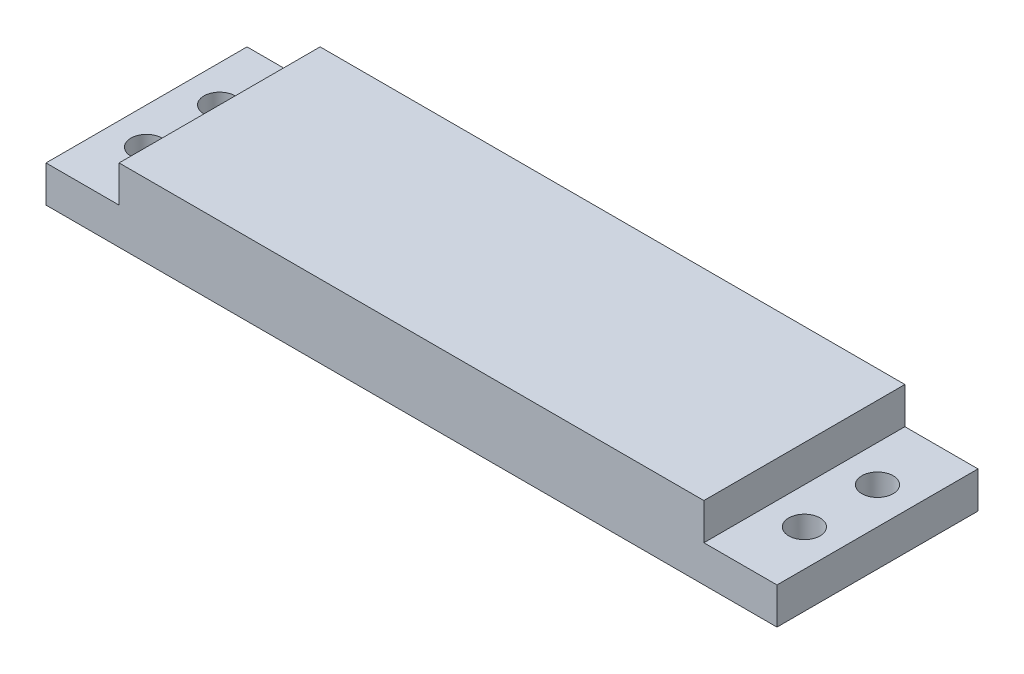
ISO-10303-21;
HEADER;
FILE_DESCRIPTION(('STEP AP214'),'2;1');
FILE_NAME('part.step','',(''),(''),'','','');
FILE_SCHEMA(('AUTOMOTIVE_DESIGN { 1 0 10303 214 1 1 1 1 }'));
ENDSEC;
DATA;
#1=APPLICATION_CONTEXT('core data for automotive mechanical design processes');
#2=APPLICATION_PROTOCOL_DEFINITION('international standard','automotive_design',2000,#1);
#3=PRODUCT_CONTEXT('',#1,'mechanical');
#4=PRODUCT('Part','Part','',(#3));
#5=PRODUCT_RELATED_PRODUCT_CATEGORY('part','',(#4));
#6=PRODUCT_DEFINITION_FORMATION('','',#4);
#7=PRODUCT_DEFINITION_CONTEXT('part definition',#1,'design');
#8=PRODUCT_DEFINITION('design','',#6,#7);
#9=PRODUCT_DEFINITION_SHAPE('','',#8);
#10=(LENGTH_UNIT() NAMED_UNIT(*) SI_UNIT(.MILLI.,.METRE.));
#11=(NAMED_UNIT(*) PLANE_ANGLE_UNIT() SI_UNIT($,.RADIAN.));
#12=(NAMED_UNIT(*) SI_UNIT($,.STERADIAN.) SOLID_ANGLE_UNIT());
#13=UNCERTAINTY_MEASURE_WITH_UNIT(LENGTH_MEASURE(1.E-05),#10,'distance_accuracy_value','');
#14=(GEOMETRIC_REPRESENTATION_CONTEXT(3) GLOBAL_UNCERTAINTY_ASSIGNED_CONTEXT((#13)) GLOBAL_UNIT_ASSIGNED_CONTEXT((#10,
#11,#12)) REPRESENTATION_CONTEXT('',''));
#15=CARTESIAN_POINT('',(0.,0.,0.));
#16=DIRECTION('',(0.,0.,1.));
#17=DIRECTION('',(1.,0.,0.));
#18=AXIS2_PLACEMENT_3D('',#15,#16,#17);
#19=CARTESIAN_POINT('',(0.,6.35,0.));
#20=DIRECTION('',(-1.,0.,0.));
#21=DIRECTION('',(0.,0.,1.));
#22=AXIS2_PLACEMENT_3D('',#19,#20,#21);
#23=PLANE('',#22);
#24=DIRECTION('',(0.,-1.,0.));
#25=VECTOR('',#24,1.);
#26=CARTESIAN_POINT('',(0.,6.35,-17.4625));
#27=LINE('',#26,#25);
#28=CARTESIAN_POINT('',(0.,3.175,-17.4625));
#29=VERTEX_POINT('',#28);
#30=CARTESIAN_POINT('',(0.,0.,-17.4625));
#31=VERTEX_POINT('',#30);
#32=EDGE_CURVE('E11',#29,#31,#27,.T.);
#33=ORIENTED_EDGE('',*,*,#32,.F.);
#34=DIRECTION('',(0.,0.,1.));
#35=VECTOR('',#34,1.);
#36=CARTESIAN_POINT('',(0.,3.175,-17.4625));
#37=LINE('',#36,#35);
#38=CARTESIAN_POINT('',(0.,3.175,0.));
#39=VERTEX_POINT('',#38);
#40=EDGE_CURVE('E104',#29,#39,#37,.T.);
#41=ORIENTED_EDGE('',*,*,#40,.T.);
#42=DIRECTION('',(0.,-1.,0.));
#43=VECTOR('',#42,1.);
#44=CARTESIAN_POINT('',(0.,6.35,0.));
#45=LINE('',#44,#43);
#46=CARTESIAN_POINT('',(0.,0.,0.));
#47=VERTEX_POINT('',#46);
#48=EDGE_CURVE('E150',#39,#47,#45,.T.);
#49=ORIENTED_EDGE('',*,*,#48,.T.);
#50=DIRECTION('',(0.,0.,-1.));
#51=VECTOR('',#50,1.);
#52=CARTESIAN_POINT('',(0.,0.,0.));
#53=LINE('',#52,#51);
#54=EDGE_CURVE('E141',#47,#31,#53,.T.);
#55=ORIENTED_EDGE('',*,*,#54,.T.);
#56=EDGE_LOOP('',(#33,#41,#49,#55));
#57=FACE_BOUND('',#56,.T.);
#58=ADVANCED_FACE('F33',(#57),#23,.F.);
#59=CARTESIAN_POINT('',(0.,6.35,-17.4625));
#60=DIRECTION('',(0.,0.,1.));
#61=DIRECTION('',(1.,0.,0.));
#62=AXIS2_PLACEMENT_3D('',#59,#60,#61);
#63=PLANE('',#62);
#64=DIRECTION('',(0.,-1.,0.));
#65=VECTOR('',#64,1.);
#66=CARTESIAN_POINT('',(-6.35,6.35,-17.4625));
#67=LINE('',#66,#65);
#68=CARTESIAN_POINT('',(-6.35,6.35,-17.4625));
#69=VERTEX_POINT('',#68);
#70=CARTESIAN_POINT('',(-6.35,3.175,-17.4625));
#71=VERTEX_POINT('',#70);
#72=EDGE_CURVE('E49',#69,#71,#67,.T.);
#73=ORIENTED_EDGE('',*,*,#72,.T.);
#74=DIRECTION('',(1.,0.,0.));
#75=VECTOR('',#74,1.);
#76=CARTESIAN_POINT('',(0.,3.175,-17.4625));
#77=LINE('',#76,#75);
#78=EDGE_CURVE('E108',#71,#29,#77,.T.);
#79=ORIENTED_EDGE('',*,*,#78,.T.);
#80=ORIENTED_EDGE('',*,*,#32,.T.);
#81=DIRECTION('',(-1.,0.,0.));
#82=VECTOR('',#81,1.);
#83=CARTESIAN_POINT('',(0.,0.,-17.4625));
#84=LINE('',#83,#82);
#85=CARTESIAN_POINT('',(-63.5,0.,-17.4625));
#86=VERTEX_POINT('',#85);
#87=EDGE_CURVE('E153',#31,#86,#84,.T.);
#88=ORIENTED_EDGE('',*,*,#87,.T.);
#89=DIRECTION('',(0.,-1.,0.));
#90=VECTOR('',#89,1.);
#91=CARTESIAN_POINT('',(-63.5,6.35,-17.4625));
#92=LINE('',#91,#90);
#93=CARTESIAN_POINT('',(-63.5,3.175,-17.4625));
#94=VERTEX_POINT('',#93);
#95=EDGE_CURVE('E41',#94,#86,#92,.T.);
#96=ORIENTED_EDGE('',*,*,#95,.F.);
#97=DIRECTION('',(1.,0.,0.));
#98=VECTOR('',#97,1.);
#99=CARTESIAN_POINT('',(-63.5,3.175,-17.4625));
#100=LINE('',#99,#98);
#101=CARTESIAN_POINT('',(-57.15,3.175,-17.4625));
#102=VERTEX_POINT('',#101);
#103=EDGE_CURVE('E130',#94,#102,#100,.T.);
#104=ORIENTED_EDGE('',*,*,#103,.T.);
#105=DIRECTION('',(0.,1.,0.));
#106=VECTOR('',#105,1.);
#107=CARTESIAN_POINT('',(-57.15,6.35,-17.4625));
#108=LINE('',#107,#106);
#109=CARTESIAN_POINT('',(-57.15,6.35,-17.4625));
#110=VERTEX_POINT('',#109);
#111=EDGE_CURVE('E133',#102,#110,#108,.T.);
#112=ORIENTED_EDGE('',*,*,#111,.T.);
#113=DIRECTION('',(-1.,0.,0.));
#114=VECTOR('',#113,1.);
#115=CARTESIAN_POINT('',(0.,6.35,-17.4625));
#116=LINE('',#115,#114);
#117=EDGE_CURVE('E117',#69,#110,#116,.T.);
#118=ORIENTED_EDGE('',*,*,#117,.F.);
#119=EDGE_LOOP('',(#73,#79,#80,#88,#96,#104,#112,#118));
#120=FACE_BOUND('',#119,.T.);
#121=ADVANCED_FACE('F115',(#120),#63,.F.);
#122=CARTESIAN_POINT('',(-63.5,6.35,0.));
#123=DIRECTION('',(1.,0.,0.));
#124=DIRECTION('',(0.,0.,-1.));
#125=AXIS2_PLACEMENT_3D('',#122,#123,#124);
#126=PLANE('',#125);
#127=DIRECTION('',(0.,-1.,0.));
#128=VECTOR('',#127,1.);
#129=CARTESIAN_POINT('',(-63.5,6.35,0.));
#130=LINE('',#129,#128);
#131=CARTESIAN_POINT('',(-63.5,3.175,0.));
#132=VERTEX_POINT('',#131);
#133=CARTESIAN_POINT('',(-63.5,0.,0.));
#134=VERTEX_POINT('',#133);
#135=EDGE_CURVE('E162',#132,#134,#130,.T.);
#136=ORIENTED_EDGE('',*,*,#135,.F.);
#137=DIRECTION('',(0.,0.,1.));
#138=VECTOR('',#137,1.);
#139=CARTESIAN_POINT('',(-63.5,3.175,-17.4625));
#140=LINE('',#139,#138);
#141=EDGE_CURVE('E135',#94,#132,#140,.T.);
#142=ORIENTED_EDGE('',*,*,#141,.F.);
#143=ORIENTED_EDGE('',*,*,#95,.T.);
#144=DIRECTION('',(0.,0.,1.));
#145=VECTOR('',#144,1.);
#146=CARTESIAN_POINT('',(-63.5,0.,0.));
#147=LINE('',#146,#145);
#148=EDGE_CURVE('E156',#86,#134,#147,.T.);
#149=ORIENTED_EDGE('',*,*,#148,.T.);
#150=EDGE_LOOP('',(#136,#142,#143,#149));
#151=FACE_BOUND('',#150,.T.);
#152=ADVANCED_FACE('F213',(#151),#126,.F.);
#153=CARTESIAN_POINT('',(0.,6.35,0.));
#154=DIRECTION('',(0.,0.,-1.));
#155=DIRECTION('',(-1.,0.,0.));
#156=AXIS2_PLACEMENT_3D('',#153,#154,#155);
#157=PLANE('',#156);
#158=ORIENTED_EDGE('',*,*,#48,.F.);
#159=DIRECTION('',(1.,0.,0.));
#160=VECTOR('',#159,1.);
#161=CARTESIAN_POINT('',(0.,3.175,0.));
#162=LINE('',#161,#160);
#163=CARTESIAN_POINT('',(-6.35,3.175,0.));
#164=VERTEX_POINT('',#163);
#165=EDGE_CURVE('E118',#164,#39,#162,.T.);
#166=ORIENTED_EDGE('',*,*,#165,.F.);
#167=DIRECTION('',(0.,-1.,0.));
#168=VECTOR('',#167,1.);
#169=CARTESIAN_POINT('',(-6.35,6.35,0.));
#170=LINE('',#169,#168);
#171=CARTESIAN_POINT('',(-6.35,6.35,0.));
#172=VERTEX_POINT('',#171);
#173=EDGE_CURVE('E101',#172,#164,#170,.T.);
#174=ORIENTED_EDGE('',*,*,#173,.F.);
#175=DIRECTION('',(1.,0.,0.));
#176=VECTOR('',#175,1.);
#177=CARTESIAN_POINT('',(0.,6.35,0.));
#178=LINE('',#177,#176);
#179=CARTESIAN_POINT('',(-57.15,6.35,0.));
#180=VERTEX_POINT('',#179);
#181=EDGE_CURVE('E146',#180,#172,#178,.T.);
#182=ORIENTED_EDGE('',*,*,#181,.F.);
#183=DIRECTION('',(0.,1.,0.));
#184=VECTOR('',#183,1.);
#185=CARTESIAN_POINT('',(-57.15,6.35,0.));
#186=LINE('',#185,#184);
#187=CARTESIAN_POINT('',(-57.15,3.175,0.));
#188=VERTEX_POINT('',#187);
#189=EDGE_CURVE('E57',#188,#180,#186,.T.);
#190=ORIENTED_EDGE('',*,*,#189,.F.);
#191=DIRECTION('',(1.,0.,0.));
#192=VECTOR('',#191,1.);
#193=CARTESIAN_POINT('',(-63.5,3.175,0.));
#194=LINE('',#193,#192);
#195=EDGE_CURVE('E127',#132,#188,#194,.T.);
#196=ORIENTED_EDGE('',*,*,#195,.F.);
#197=ORIENTED_EDGE('',*,*,#135,.T.);
#198=DIRECTION('',(1.,0.,0.));
#199=VECTOR('',#198,1.);
#200=CARTESIAN_POINT('',(0.,0.,0.));
#201=LINE('',#200,#199);
#202=EDGE_CURVE('E147',#134,#47,#201,.T.);
#203=ORIENTED_EDGE('',*,*,#202,.T.);
#204=EDGE_LOOP('',(#158,#166,#174,#182,#190,#196,#197,#203));
#205=FACE_BOUND('',#204,.T.);
#206=ADVANCED_FACE('F231',(#205),#157,.F.);
#207=CARTESIAN_POINT('',(0.,6.35,0.));
#208=DIRECTION('',(0.,1.,0.));
#209=DIRECTION('',(0.,0.,1.));
#210=AXIS2_PLACEMENT_3D('',#207,#208,#209);
#211=PLANE('',#210);
#212=DIRECTION('',(0.,0.,1.));
#213=VECTOR('',#212,1.);
#214=CARTESIAN_POINT('',(-6.35,6.35,-17.4625));
#215=LINE('',#214,#213);
#216=EDGE_CURVE('E105',#69,#172,#215,.T.);
#217=ORIENTED_EDGE('',*,*,#216,.F.);
#218=ORIENTED_EDGE('',*,*,#117,.T.);
#219=DIRECTION('',(0.,0.,1.));
#220=VECTOR('',#219,1.);
#221=CARTESIAN_POINT('',(-57.15,6.35,-17.4625));
#222=LINE('',#221,#220);
#223=EDGE_CURVE('E139',#110,#180,#222,.T.);
#224=ORIENTED_EDGE('',*,*,#223,.T.);
#225=ORIENTED_EDGE('',*,*,#181,.T.);
#226=EDGE_LOOP('',(#217,#218,#224,#225));
#227=FACE_BOUND('',#226,.T.);
#228=ADVANCED_FACE('F229',(#227),#211,.T.);
#229=CARTESIAN_POINT('',(0.,0.,0.));
#230=DIRECTION('',(0.,1.,0.));
#231=DIRECTION('',(0.,0.,1.));
#232=AXIS2_PLACEMENT_3D('',#229,#230,#231);
#233=PLANE('',#232);
#234=CARTESIAN_POINT('',(-3.175,0.,-11.90625));
#235=DIRECTION('',(0.,1.,0.));
#236=DIRECTION('',(0.,0.,-1.));
#237=AXIS2_PLACEMENT_3D('',#234,#235,#236);
#238=CIRCLE('',#237,1.35792986898391);
#239=CARTESIAN_POINT('',(-3.175,0.,-13.2641798689839));
#240=VERTEX_POINT('',#239);
#241=EDGE_CURVE('E181',#240,#240,#238,.T.);
#242=ORIENTED_EDGE('',*,*,#241,.T.);
#243=EDGE_LOOP('',(#242));
#244=FACE_BOUND('',#243,.T.);
#245=CARTESIAN_POINT('',(-3.175,0.,-5.55624999999999));
#246=DIRECTION('',(0.,1.,0.));
#247=DIRECTION('',(0.,0.,1.));
#248=AXIS2_PLACEMENT_3D('',#245,#246,#247);
#249=CIRCLE('',#248,1.35792986898391);
#250=CARTESIAN_POINT('',(-3.175,0.,-4.19832013101608));
#251=VERTEX_POINT('',#250);
#252=EDGE_CURVE('E172',#251,#251,#249,.T.);
#253=ORIENTED_EDGE('',*,*,#252,.T.);
#254=EDGE_LOOP('',(#253));
#255=FACE_BOUND('',#254,.T.);
#256=CARTESIAN_POINT('',(-60.325,0.,-5.55625));
#257=DIRECTION('',(0.,1.,0.));
#258=DIRECTION('',(0.,0.,-1.));
#259=AXIS2_PLACEMENT_3D('',#256,#257,#258);
#260=CIRCLE('',#259,1.35792986898391);
#261=CARTESIAN_POINT('',(-60.325,0.,-6.9141798689839));
#262=VERTEX_POINT('',#261);
#263=EDGE_CURVE('E169',#262,#262,#260,.T.);
#264=ORIENTED_EDGE('',*,*,#263,.T.);
#265=EDGE_LOOP('',(#264));
#266=FACE_BOUND('',#265,.T.);
#267=CARTESIAN_POINT('',(-60.325,0.,-11.90625));
#268=DIRECTION('',(0.,1.,0.));
#269=DIRECTION('',(0.,0.,1.));
#270=AXIS2_PLACEMENT_3D('',#267,#268,#269);
#271=CIRCLE('',#270,1.35792986898391);
#272=CARTESIAN_POINT('',(-60.325,0.,-10.5483201310161));
#273=VERTEX_POINT('',#272);
#274=EDGE_CURVE('E122',#273,#273,#271,.T.);
#275=ORIENTED_EDGE('',*,*,#274,.T.);
#276=EDGE_LOOP('',(#275));
#277=FACE_BOUND('',#276,.T.);
#278=ORIENTED_EDGE('',*,*,#54,.F.);
#279=ORIENTED_EDGE('',*,*,#202,.F.);
#280=ORIENTED_EDGE('',*,*,#148,.F.);
#281=ORIENTED_EDGE('',*,*,#87,.F.);
#282=EDGE_LOOP('',(#278,#279,#280,#281));
#283=FACE_BOUND('',#282,.T.);
#284=ADVANCED_FACE('F186',(#244,#255,#266,#277,#283),#233,.F.);
#285=CARTESIAN_POINT('',(-57.15,6.35,-17.4625));
#286=DIRECTION('',(1.,0.,0.));
#287=DIRECTION('',(0.,0.,-1.));
#288=AXIS2_PLACEMENT_3D('',#285,#286,#287);
#289=PLANE('',#288);
#290=ORIENTED_EDGE('',*,*,#189,.T.);
#291=ORIENTED_EDGE('',*,*,#223,.F.);
#292=ORIENTED_EDGE('',*,*,#111,.F.);
#293=DIRECTION('',(0.,0.,1.));
#294=VECTOR('',#293,1.);
#295=CARTESIAN_POINT('',(-57.15,3.175,-17.4625));
#296=LINE('',#295,#294);
#297=EDGE_CURVE('E142',#102,#188,#296,.T.);
#298=ORIENTED_EDGE('',*,*,#297,.T.);
#299=EDGE_LOOP('',(#290,#291,#292,#298));
#300=FACE_BOUND('',#299,.T.);
#301=ADVANCED_FACE('F204',(#300),#289,.F.);
#302=CARTESIAN_POINT('',(-63.5,3.175,-17.4625));
#303=DIRECTION('',(0.,-1.,0.));
#304=DIRECTION('',(0.,0.,-1.));
#305=AXIS2_PLACEMENT_3D('',#302,#303,#304);
#306=PLANE('',#305);
#307=CARTESIAN_POINT('',(-60.325,3.175,-5.55625));
#308=DIRECTION('',(0.,-1.,0.));
#309=DIRECTION('',(0.,0.,-1.));
#310=AXIS2_PLACEMENT_3D('',#307,#308,#309);
#311=CIRCLE('',#310,1.35792986898391);
#312=CARTESIAN_POINT('',(-60.325,3.175,-6.9141798689839));
#313=VERTEX_POINT('',#312);
#314=EDGE_CURVE('E167',#313,#313,#311,.T.);
#315=ORIENTED_EDGE('',*,*,#314,.T.);
#316=EDGE_LOOP('',(#315));
#317=FACE_BOUND('',#316,.T.);
#318=CARTESIAN_POINT('',(-60.325,3.175,-11.90625));
#319=DIRECTION('',(0.,-1.,0.));
#320=DIRECTION('',(0.,0.,-1.));
#321=AXIS2_PLACEMENT_3D('',#318,#319,#320);
#322=CIRCLE('',#321,1.35792986898391);
#323=CARTESIAN_POINT('',(-60.325,3.175,-13.2641798689839));
#324=VERTEX_POINT('',#323);
#325=EDGE_CURVE('E125',#324,#324,#322,.T.);
#326=ORIENTED_EDGE('',*,*,#325,.T.);
#327=EDGE_LOOP('',(#326));
#328=FACE_BOUND('',#327,.T.);
#329=ORIENTED_EDGE('',*,*,#195,.T.);
#330=ORIENTED_EDGE('',*,*,#297,.F.);
#331=ORIENTED_EDGE('',*,*,#103,.F.);
#332=ORIENTED_EDGE('',*,*,#141,.T.);
#333=EDGE_LOOP('',(#329,#330,#331,#332));
#334=FACE_BOUND('',#333,.T.);
#335=ADVANCED_FACE('F196',(#317,#328,#334),#306,.F.);
#336=CARTESIAN_POINT('',(0.,3.175,-17.4625));
#337=DIRECTION('',(0.,-1.,0.));
#338=DIRECTION('',(0.,0.,-1.));
#339=AXIS2_PLACEMENT_3D('',#336,#337,#338);
#340=PLANE('',#339);
#341=CARTESIAN_POINT('',(-3.175,3.175,-11.90625));
#342=DIRECTION('',(0.,-1.,0.));
#343=DIRECTION('',(0.,0.,-1.));
#344=AXIS2_PLACEMENT_3D('',#341,#342,#343);
#345=CIRCLE('',#344,1.35792986898391);
#346=CARTESIAN_POINT('',(-3.175,3.175,-13.2641798689839));
#347=VERTEX_POINT('',#346);
#348=EDGE_CURVE('E36',#347,#347,#345,.T.);
#349=ORIENTED_EDGE('',*,*,#348,.T.);
#350=EDGE_LOOP('',(#349));
#351=FACE_BOUND('',#350,.T.);
#352=CARTESIAN_POINT('',(-3.175,3.175,-5.55624999999999));
#353=DIRECTION('',(0.,-1.,0.));
#354=DIRECTION('',(0.,0.,-1.));
#355=AXIS2_PLACEMENT_3D('',#352,#353,#354);
#356=CIRCLE('',#355,1.35792986898391);
#357=CARTESIAN_POINT('',(-3.175,3.175,-6.9141798689839));
#358=VERTEX_POINT('',#357);
#359=EDGE_CURVE('E170',#358,#358,#356,.T.);
#360=ORIENTED_EDGE('',*,*,#359,.T.);
#361=EDGE_LOOP('',(#360));
#362=FACE_BOUND('',#361,.T.);
#363=ORIENTED_EDGE('',*,*,#165,.T.);
#364=ORIENTED_EDGE('',*,*,#40,.F.);
#365=ORIENTED_EDGE('',*,*,#78,.F.);
#366=DIRECTION('',(0.,0.,1.));
#367=VECTOR('',#366,1.);
#368=CARTESIAN_POINT('',(-6.35,3.175,-17.4625));
#369=LINE('',#368,#367);
#370=EDGE_CURVE('E97',#71,#164,#369,.T.);
#371=ORIENTED_EDGE('',*,*,#370,.T.);
#372=EDGE_LOOP('',(#363,#364,#365,#371));
#373=FACE_BOUND('',#372,.T.);
#374=ADVANCED_FACE('F109',(#351,#362,#373),#340,.F.);
#375=CARTESIAN_POINT('',(-6.35,6.35,-17.4625));
#376=DIRECTION('',(-1.,0.,0.));
#377=DIRECTION('',(0.,0.,1.));
#378=AXIS2_PLACEMENT_3D('',#375,#376,#377);
#379=PLANE('',#378);
#380=ORIENTED_EDGE('',*,*,#173,.T.);
#381=ORIENTED_EDGE('',*,*,#370,.F.);
#382=ORIENTED_EDGE('',*,*,#72,.F.);
#383=ORIENTED_EDGE('',*,*,#216,.T.);
#384=EDGE_LOOP('',(#380,#381,#382,#383));
#385=FACE_BOUND('',#384,.T.);
#386=ADVANCED_FACE('F99',(#385),#379,.F.);
#387=CARTESIAN_POINT('',(-60.325,0.,-11.90625));
#388=DIRECTION('',(0.,1.,0.));
#389=DIRECTION('',(0.,0.,1.));
#390=AXIS2_PLACEMENT_3D('',#387,#388,#389);
#391=CYLINDRICAL_SURFACE('',#390,1.35792986898391);
#392=ORIENTED_EDGE('',*,*,#274,.F.);
#393=EDGE_LOOP('',(#392));
#394=FACE_BOUND('',#393,.T.);
#395=ORIENTED_EDGE('',*,*,#325,.F.);
#396=EDGE_LOOP('',(#395));
#397=FACE_BOUND('',#396,.T.);
#398=ADVANCED_FACE('F202',(#394,#397),#391,.F.);
#399=CARTESIAN_POINT('',(-60.325,0.,-5.55625));
#400=DIRECTION('',(0.,1.,0.));
#401=DIRECTION('',(0.,0.,1.));
#402=AXIS2_PLACEMENT_3D('',#399,#400,#401);
#403=CYLINDRICAL_SURFACE('',#402,1.35792986898391);
#404=ORIENTED_EDGE('',*,*,#263,.F.);
#405=EDGE_LOOP('',(#404));
#406=FACE_BOUND('',#405,.T.);
#407=ORIENTED_EDGE('',*,*,#314,.F.);
#408=EDGE_LOOP('',(#407));
#409=FACE_BOUND('',#408,.T.);
#410=ADVANCED_FACE('F270',(#406,#409),#403,.F.);
#411=CARTESIAN_POINT('',(-3.175,0.,-5.55624999999999));
#412=DIRECTION('',(0.,1.,0.));
#413=DIRECTION('',(0.,0.,1.));
#414=AXIS2_PLACEMENT_3D('',#411,#412,#413);
#415=CYLINDRICAL_SURFACE('',#414,1.35792986898391);
#416=ORIENTED_EDGE('',*,*,#252,.F.);
#417=EDGE_LOOP('',(#416));
#418=FACE_BOUND('',#417,.T.);
#419=ORIENTED_EDGE('',*,*,#359,.F.);
#420=EDGE_LOOP('',(#419));
#421=FACE_BOUND('',#420,.T.);
#422=ADVANCED_FACE('F191',(#418,#421),#415,.F.);
#423=CARTESIAN_POINT('',(-3.175,0.,-11.90625));
#424=DIRECTION('',(0.,1.,0.));
#425=DIRECTION('',(0.,0.,1.));
#426=AXIS2_PLACEMENT_3D('',#423,#424,#425);
#427=CYLINDRICAL_SURFACE('',#426,1.35792986898391);
#428=ORIENTED_EDGE('',*,*,#241,.F.);
#429=EDGE_LOOP('',(#428));
#430=FACE_BOUND('',#429,.T.);
#431=ORIENTED_EDGE('',*,*,#348,.F.);
#432=EDGE_LOOP('',(#431));
#433=FACE_BOUND('',#432,.T.);
#434=ADVANCED_FACE('F188',(#430,#433),#427,.F.);
#435=CLOSED_SHELL('',(#58,#121,#152,#206,#228,#284,#301,#335,#374,#386,#398,#410,#422,#434));
#436=MANIFOLD_SOLID_BREP('B2',#435);
#437=ADVANCED_BREP_SHAPE_REPRESENTATION('',(#18,#436),#14);
#438=SHAPE_DEFINITION_REPRESENTATION(#9,#437);
ENDSEC;
END-ISO-10303-21;
